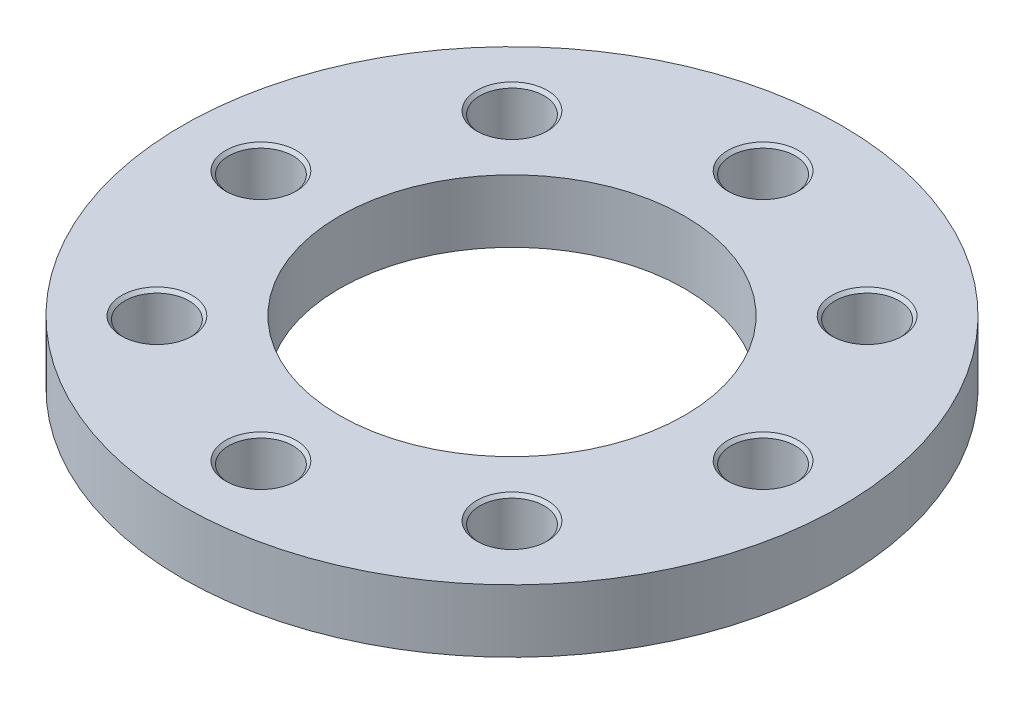
ISO-10303-21;
HEADER;
FILE_DESCRIPTION(('STEP AP214'),'2;1');
FILE_NAME('part.step','',(''),(''),'','','');
FILE_SCHEMA(('AUTOMOTIVE_DESIGN { 1 0 10303 214 1 1 1 1 }'));
ENDSEC;
DATA;
#1=APPLICATION_CONTEXT('core data for automotive mechanical design processes');
#2=APPLICATION_PROTOCOL_DEFINITION('international standard','automotive_design',2000,#1);
#3=PRODUCT_CONTEXT('',#1,'mechanical');
#4=PRODUCT('Part','Part','',(#3));
#5=PRODUCT_RELATED_PRODUCT_CATEGORY('part','',(#4));
#6=PRODUCT_DEFINITION_FORMATION('','',#4);
#7=PRODUCT_DEFINITION_CONTEXT('part definition',#1,'design');
#8=PRODUCT_DEFINITION('design','',#6,#7);
#9=PRODUCT_DEFINITION_SHAPE('','',#8);
#10=(LENGTH_UNIT() NAMED_UNIT(*) SI_UNIT(.MILLI.,.METRE.));
#11=(NAMED_UNIT(*) PLANE_ANGLE_UNIT() SI_UNIT($,.RADIAN.));
#12=(NAMED_UNIT(*) SI_UNIT($,.STERADIAN.) SOLID_ANGLE_UNIT());
#13=UNCERTAINTY_MEASURE_WITH_UNIT(LENGTH_MEASURE(1.E-05),#10,'distance_accuracy_value','');
#14=(GEOMETRIC_REPRESENTATION_CONTEXT(3) GLOBAL_UNCERTAINTY_ASSIGNED_CONTEXT((#13)) GLOBAL_UNIT_ASSIGNED_CONTEXT((#10,
#11,#12)) REPRESENTATION_CONTEXT('',''));
#15=CARTESIAN_POINT('',(0.,0.,0.));
#16=DIRECTION('',(0.,0.,1.));
#17=DIRECTION('',(1.,0.,0.));
#18=AXIS2_PLACEMENT_3D('',#15,#16,#17);
#19=CARTESIAN_POINT('',(0.,4.,0.));
#20=DIRECTION('',(0.,-1.,0.));
#21=DIRECTION('',(0.,0.,-1.));
#22=AXIS2_PLACEMENT_3D('',#19,#20,#21);
#23=CYLINDRICAL_SURFACE('',#22,11.);
#24=CARTESIAN_POINT('',(0.,4.,0.));
#25=DIRECTION('',(0.,1.,0.));
#26=DIRECTION('',(0.,0.,1.));
#27=AXIS2_PLACEMENT_3D('',#24,#25,#26);
#28=CIRCLE('',#27,11.);
#29=CARTESIAN_POINT('',(0.,4.,11.));
#30=VERTEX_POINT('',#29);
#31=EDGE_CURVE('E191',#30,#30,#28,.T.);
#32=ORIENTED_EDGE('',*,*,#31,.T.);
#33=EDGE_LOOP('',(#32));
#34=FACE_BOUND('',#33,.T.);
#35=CARTESIAN_POINT('',(0.,0.,0.));
#36=DIRECTION('',(0.,1.,0.));
#37=DIRECTION('',(0.,0.,1.));
#38=AXIS2_PLACEMENT_3D('',#35,#36,#37);
#39=CIRCLE('',#38,11.);
#40=CARTESIAN_POINT('',(0.,0.,11.));
#41=VERTEX_POINT('',#40);
#42=EDGE_CURVE('E192',#41,#41,#39,.T.);
#43=ORIENTED_EDGE('',*,*,#42,.F.);
#44=EDGE_LOOP('',(#43));
#45=FACE_BOUND('',#44,.T.);
#46=ADVANCED_FACE('F49',(#34,#45),#23,.F.);
#47=CARTESIAN_POINT('',(0.,4.,0.));
#48=DIRECTION('',(0.,-1.,0.));
#49=DIRECTION('',(0.,0.,-1.));
#50=AXIS2_PLACEMENT_3D('',#47,#48,#49);
#51=CYLINDRICAL_SURFACE('',#50,21.);
#52=CARTESIAN_POINT('',(0.,4.,0.));
#53=DIRECTION('',(0.,1.,0.));
#54=DIRECTION('',(0.,0.,1.));
#55=AXIS2_PLACEMENT_3D('',#52,#53,#54);
#56=CIRCLE('',#55,21.);
#57=CARTESIAN_POINT('',(0.,4.,21.));
#58=VERTEX_POINT('',#57);
#59=EDGE_CURVE('E186',#58,#58,#56,.T.);
#60=ORIENTED_EDGE('',*,*,#59,.F.);
#61=EDGE_LOOP('',(#60));
#62=FACE_BOUND('',#61,.T.);
#63=CARTESIAN_POINT('',(0.,0.,0.));
#64=DIRECTION('',(0.,1.,0.));
#65=DIRECTION('',(0.,0.,1.));
#66=AXIS2_PLACEMENT_3D('',#63,#64,#65);
#67=CIRCLE('',#66,21.);
#68=CARTESIAN_POINT('',(0.,0.,21.));
#69=VERTEX_POINT('',#68);
#70=EDGE_CURVE('E187',#69,#69,#67,.T.);
#71=ORIENTED_EDGE('',*,*,#70,.T.);
#72=EDGE_LOOP('',(#71));
#73=FACE_BOUND('',#72,.T.);
#74=ADVANCED_FACE('F209',(#62,#73),#51,.T.);
#75=CARTESIAN_POINT('',(0.,4.,0.));
#76=DIRECTION('',(0.,1.,0.));
#77=DIRECTION('',(0.,0.,1.));
#78=AXIS2_PLACEMENT_3D('',#75,#76,#77);
#79=PLANE('',#78);
#80=CARTESIAN_POINT('',(11.3137084989849,4.,11.3137084989846));
#81=DIRECTION('',(0.,1.,0.));
#82=DIRECTION('',(0.,0.,1.));
#83=AXIS2_PLACEMENT_3D('',#80,#81,#82);
#84=CIRCLE('',#83,2.24999999999998);
#85=CARTESIAN_POINT('',(11.3137084989849,4.,13.5637084989846));
#86=VERTEX_POINT('',#85);
#87=EDGE_CURVE('E58',#86,#86,#84,.F.);
#88=ORIENTED_EDGE('',*,*,#87,.T.);
#89=EDGE_LOOP('',(#88));
#90=FACE_BOUND('',#89,.T.);
#91=CARTESIAN_POINT('',(1.6759110426447E-13,4.,16.));
#92=DIRECTION('',(0.,1.,0.));
#93=DIRECTION('',(0.,0.,1.));
#94=AXIS2_PLACEMENT_3D('',#91,#92,#93);
#95=CIRCLE('',#94,2.25);
#96=CARTESIAN_POINT('',(1.6759110426447E-13,4.,18.25));
#97=VERTEX_POINT('',#96);
#98=EDGE_CURVE('E82',#97,#97,#95,.F.);
#99=ORIENTED_EDGE('',*,*,#98,.T.);
#100=EDGE_LOOP('',(#99));
#101=FACE_BOUND('',#100,.T.);
#102=CARTESIAN_POINT('',(-11.3137084989847,4.,11.3137084989849));
#103=DIRECTION('',(0.,1.,0.));
#104=DIRECTION('',(0.,0.,1.));
#105=AXIS2_PLACEMENT_3D('',#102,#103,#104);
#106=CIRCLE('',#105,2.25);
#107=CARTESIAN_POINT('',(-11.3137084989847,4.,13.5637084989849));
#108=VERTEX_POINT('',#107);
#109=EDGE_CURVE('E97',#108,#108,#106,.F.);
#110=ORIENTED_EDGE('',*,*,#109,.T.);
#111=EDGE_LOOP('',(#110));
#112=FACE_BOUND('',#111,.T.);
#113=CARTESIAN_POINT('',(-16.,4.,0.));
#114=DIRECTION('',(0.,1.,0.));
#115=DIRECTION('',(0.,0.,1.));
#116=AXIS2_PLACEMENT_3D('',#113,#114,#115);
#117=CIRCLE('',#116,2.25);
#118=CARTESIAN_POINT('',(-16.,4.,2.25));
#119=VERTEX_POINT('',#118);
#120=EDGE_CURVE('E113',#119,#119,#117,.F.);
#121=ORIENTED_EDGE('',*,*,#120,.T.);
#122=EDGE_LOOP('',(#121));
#123=FACE_BOUND('',#122,.T.);
#124=CARTESIAN_POINT('',(-11.3137084989848,4.,-11.3137084989847));
#125=DIRECTION('',(0.,1.,0.));
#126=DIRECTION('',(0.,0.,1.));
#127=AXIS2_PLACEMENT_3D('',#124,#125,#126);
#128=CIRCLE('',#127,2.25000000000001);
#129=CARTESIAN_POINT('',(-11.3137084989848,4.,-9.06370849898469));
#130=VERTEX_POINT('',#129);
#131=EDGE_CURVE('E128',#130,#130,#128,.F.);
#132=ORIENTED_EDGE('',*,*,#131,.T.);
#133=EDGE_LOOP('',(#132));
#134=FACE_BOUND('',#133,.T.);
#135=CARTESIAN_POINT('',(0.,4.,-16.));
#136=DIRECTION('',(0.,1.,0.));
#137=DIRECTION('',(0.,0.,1.));
#138=AXIS2_PLACEMENT_3D('',#135,#136,#137);
#139=CIRCLE('',#138,2.25);
#140=CARTESIAN_POINT('',(0.,4.,-13.75));
#141=VERTEX_POINT('',#140);
#142=EDGE_CURVE('E143',#141,#141,#139,.F.);
#143=ORIENTED_EDGE('',*,*,#142,.T.);
#144=EDGE_LOOP('',(#143));
#145=FACE_BOUND('',#144,.T.);
#146=CARTESIAN_POINT('',(11.3137084989847,4.,-11.3137084989848));
#147=DIRECTION('',(0.,1.,0.));
#148=DIRECTION('',(0.,0.,1.));
#149=AXIS2_PLACEMENT_3D('',#146,#147,#148);
#150=CIRCLE('',#149,2.25);
#151=CARTESIAN_POINT('',(11.3137084989847,4.,-9.06370849898478));
#152=VERTEX_POINT('',#151);
#153=EDGE_CURVE('E158',#152,#152,#150,.F.);
#154=ORIENTED_EDGE('',*,*,#153,.T.);
#155=EDGE_LOOP('',(#154));
#156=FACE_BOUND('',#155,.T.);
#157=CARTESIAN_POINT('',(16.,4.,0.));
#158=DIRECTION('',(0.,1.,0.));
#159=DIRECTION('',(0.,0.,1.));
#160=AXIS2_PLACEMENT_3D('',#157,#158,#159);
#161=CIRCLE('',#160,2.25);
#162=CARTESIAN_POINT('',(16.,4.,2.25));
#163=VERTEX_POINT('',#162);
#164=EDGE_CURVE('E174',#163,#163,#161,.F.);
#165=ORIENTED_EDGE('',*,*,#164,.T.);
#166=EDGE_LOOP('',(#165));
#167=FACE_BOUND('',#166,.T.);
#168=ORIENTED_EDGE('',*,*,#31,.F.);
#169=EDGE_LOOP('',(#168));
#170=FACE_BOUND('',#169,.T.);
#171=ORIENTED_EDGE('',*,*,#59,.T.);
#172=EDGE_LOOP('',(#171));
#173=FACE_BOUND('',#172,.T.);
#174=ADVANCED_FACE('F205',(#90,#101,#112,#123,#134,#145,#156,#167,#170,#173),#79,.T.);
#175=CARTESIAN_POINT('',(0.,0.,0.));
#176=DIRECTION('',(0.,1.,0.));
#177=DIRECTION('',(0.,0.,1.));
#178=AXIS2_PLACEMENT_3D('',#175,#176,#177);
#179=PLANE('',#178);
#180=CARTESIAN_POINT('',(11.3137084989849,0.,11.3137084989846));
#181=DIRECTION('',(0.,1.,0.));
#182=DIRECTION('',(0.,0.,1.));
#183=AXIS2_PLACEMENT_3D('',#180,#181,#182);
#184=CIRCLE('',#183,2.25);
#185=CARTESIAN_POINT('',(11.3137084989849,0.,13.5637084989846));
#186=VERTEX_POINT('',#185);
#187=EDGE_CURVE('E10',#186,#186,#184,.T.);
#188=ORIENTED_EDGE('',*,*,#187,.T.);
#189=EDGE_LOOP('',(#188));
#190=FACE_BOUND('',#189,.T.);
#191=CARTESIAN_POINT('',(1.6759110426447E-13,0.,16.));
#192=DIRECTION('',(0.,1.,0.));
#193=DIRECTION('',(0.,0.,1.));
#194=AXIS2_PLACEMENT_3D('',#191,#192,#193);
#195=CIRCLE('',#194,2.25);
#196=CARTESIAN_POINT('',(1.6759110426447E-13,0.,13.75));
#197=VERTEX_POINT('',#196);
#198=EDGE_CURVE('E78',#197,#197,#195,.T.);
#199=ORIENTED_EDGE('',*,*,#198,.T.);
#200=EDGE_LOOP('',(#199));
#201=FACE_BOUND('',#200,.T.);
#202=CARTESIAN_POINT('',(-11.3137084989847,0.,11.3137084989849));
#203=DIRECTION('',(0.,1.,0.));
#204=DIRECTION('',(0.,0.,1.));
#205=AXIS2_PLACEMENT_3D('',#202,#203,#204);
#206=CIRCLE('',#205,2.25);
#207=CARTESIAN_POINT('',(-11.3137084989847,0.,13.5637084989849));
#208=VERTEX_POINT('',#207);
#209=EDGE_CURVE('E93',#208,#208,#206,.T.);
#210=ORIENTED_EDGE('',*,*,#209,.T.);
#211=EDGE_LOOP('',(#210));
#212=FACE_BOUND('',#211,.T.);
#213=CARTESIAN_POINT('',(-16.,0.,0.));
#214=DIRECTION('',(0.,1.,0.));
#215=DIRECTION('',(0.,0.,1.));
#216=AXIS2_PLACEMENT_3D('',#213,#214,#215);
#217=CIRCLE('',#216,2.25);
#218=CARTESIAN_POINT('',(-16.,0.,-2.25));
#219=VERTEX_POINT('',#218);
#220=EDGE_CURVE('E109',#219,#219,#217,.T.);
#221=ORIENTED_EDGE('',*,*,#220,.T.);
#222=EDGE_LOOP('',(#221));
#223=FACE_BOUND('',#222,.T.);
#224=CARTESIAN_POINT('',(-11.3137084989848,0.,-11.3137084989847));
#225=DIRECTION('',(0.,1.,0.));
#226=DIRECTION('',(0.,0.,1.));
#227=AXIS2_PLACEMENT_3D('',#224,#225,#226);
#228=CIRCLE('',#227,2.24999999999999);
#229=CARTESIAN_POINT('',(-11.3137084989848,0.,-9.06370849898471));
#230=VERTEX_POINT('',#229);
#231=EDGE_CURVE('E124',#230,#230,#228,.T.);
#232=ORIENTED_EDGE('',*,*,#231,.T.);
#233=EDGE_LOOP('',(#232));
#234=FACE_BOUND('',#233,.T.);
#235=CARTESIAN_POINT('',(0.,0.,-16.));
#236=DIRECTION('',(0.,1.,0.));
#237=DIRECTION('',(0.,0.,1.));
#238=AXIS2_PLACEMENT_3D('',#235,#236,#237);
#239=CIRCLE('',#238,2.25);
#240=CARTESIAN_POINT('',(0.,0.,-18.25));
#241=VERTEX_POINT('',#240);
#242=EDGE_CURVE('E139',#241,#241,#239,.T.);
#243=ORIENTED_EDGE('',*,*,#242,.T.);
#244=EDGE_LOOP('',(#243));
#245=FACE_BOUND('',#244,.T.);
#246=CARTESIAN_POINT('',(11.3137084989847,0.,-11.3137084989848));
#247=DIRECTION('',(0.,1.,0.));
#248=DIRECTION('',(0.,0.,1.));
#249=AXIS2_PLACEMENT_3D('',#246,#247,#248);
#250=CIRCLE('',#249,2.25);
#251=CARTESIAN_POINT('',(11.3137084989847,0.,-9.06370849898478));
#252=VERTEX_POINT('',#251);
#253=EDGE_CURVE('E154',#252,#252,#250,.T.);
#254=ORIENTED_EDGE('',*,*,#253,.T.);
#255=EDGE_LOOP('',(#254));
#256=FACE_BOUND('',#255,.T.);
#257=CARTESIAN_POINT('',(16.,0.,0.));
#258=DIRECTION('',(0.,1.,0.));
#259=DIRECTION('',(0.,0.,1.));
#260=AXIS2_PLACEMENT_3D('',#257,#258,#259);
#261=CIRCLE('',#260,2.25);
#262=CARTESIAN_POINT('',(16.,0.,-2.25));
#263=VERTEX_POINT('',#262);
#264=EDGE_CURVE('E170',#263,#263,#261,.T.);
#265=ORIENTED_EDGE('',*,*,#264,.T.);
#266=EDGE_LOOP('',(#265));
#267=FACE_BOUND('',#266,.T.);
#268=ORIENTED_EDGE('',*,*,#42,.T.);
#269=EDGE_LOOP('',(#268));
#270=FACE_BOUND('',#269,.T.);
#271=ORIENTED_EDGE('',*,*,#70,.F.);
#272=EDGE_LOOP('',(#271));
#273=FACE_BOUND('',#272,.T.);
#274=ADVANCED_FACE('F208',(#190,#201,#212,#223,#234,#245,#256,#267,#270,#273),#179,.F.);
#275=CARTESIAN_POINT('',(16.,0.,0.));
#276=DIRECTION('',(0.,1.,0.));
#277=DIRECTION('',(0.,0.,1.));
#278=AXIS2_PLACEMENT_3D('',#275,#276,#277);
#279=CYLINDRICAL_SURFACE('',#278,2.05);
#280=CARTESIAN_POINT('',(16.,3.8,0.));
#281=DIRECTION('',(0.,1.,0.));
#282=DIRECTION('',(0.,0.,1.));
#283=AXIS2_PLACEMENT_3D('',#280,#281,#282);
#284=CIRCLE('',#283,2.05);
#285=CARTESIAN_POINT('',(16.,3.8,2.05));
#286=VERTEX_POINT('',#285);
#287=EDGE_CURVE('E178',#286,#286,#284,.T.);
#288=ORIENTED_EDGE('',*,*,#287,.T.);
#289=EDGE_LOOP('',(#288));
#290=FACE_BOUND('',#289,.T.);
#291=CARTESIAN_POINT('',(16.,0.200000000000005,0.));
#292=DIRECTION('',(0.,1.,0.));
#293=DIRECTION('',(0.,0.,1.));
#294=AXIS2_PLACEMENT_3D('',#291,#292,#293);
#295=CIRCLE('',#294,2.05);
#296=CARTESIAN_POINT('',(16.,0.200000000000005,-2.05));
#297=VERTEX_POINT('',#296);
#298=EDGE_CURVE('E182',#297,#297,#295,.F.);
#299=ORIENTED_EDGE('',*,*,#298,.T.);
#300=EDGE_LOOP('',(#299));
#301=FACE_BOUND('',#300,.T.);
#302=ADVANCED_FACE('F219',(#290,#301),#279,.F.);
#303=CARTESIAN_POINT('',(16.,3.8,0.));
#304=DIRECTION('',(0.,1.,0.));
#305=DIRECTION('',(0.,0.,1.));
#306=AXIS2_PLACEMENT_3D('',#303,#304,#305);
#307=CONICAL_SURFACE('',#306,2.05,0.785398163397439);
#308=ORIENTED_EDGE('',*,*,#164,.F.);
#309=EDGE_LOOP('',(#308));
#310=FACE_BOUND('',#309,.T.);
#311=ORIENTED_EDGE('',*,*,#287,.F.);
#312=EDGE_LOOP('',(#311));
#313=FACE_BOUND('',#312,.T.);
#314=ADVANCED_FACE('F223',(#310,#313),#307,.F.);
#315=CARTESIAN_POINT('',(16.,0.,0.));
#316=DIRECTION('',(0.,-1.,0.));
#317=DIRECTION('',(0.,0.,-1.));
#318=AXIS2_PLACEMENT_3D('',#315,#316,#317);
#319=CONICAL_SURFACE('',#318,2.25,0.785398163397441);
#320=CARTESIAN_POINT('',(16.,0.200000000000005,-2.05));
#321=CARTESIAN_POINT('',(16.,0.197916666666672,-2.05208333333333));
#322=CARTESIAN_POINT('',(16.,0.195833333333338,-2.05416666666667));
#323=CARTESIAN_POINT('',(16.,0.191666666666671,-2.05833333333333));
#324=CARTESIAN_POINT('',(16.,0.189583333333338,-2.06041666666667));
#325=CARTESIAN_POINT('',(16.,0.185416666666671,-2.06458333333333));
#326=CARTESIAN_POINT('',(16.,0.183333333333338,-2.06666666666667));
#327=CARTESIAN_POINT('',(16.,0.179166666666671,-2.07083333333333));
#328=CARTESIAN_POINT('',(16.,0.177083333333338,-2.07291666666667));
#329=CARTESIAN_POINT('',(16.,0.172916666666671,-2.07708333333333));
#330=CARTESIAN_POINT('',(16.,0.170833333333338,-2.07916666666667));
#331=CARTESIAN_POINT('',(16.,0.166666666666671,-2.08333333333333));
#332=CARTESIAN_POINT('',(16.,0.164583333333337,-2.08541666666667));
#333=CARTESIAN_POINT('',(16.,0.160416666666671,-2.08958333333333));
#334=CARTESIAN_POINT('',(16.,0.158333333333337,-2.09166666666667));
#335=CARTESIAN_POINT('',(16.,0.15416666666667,-2.09583333333333));
#336=CARTESIAN_POINT('',(16.,0.152083333333337,-2.09791666666667));
#337=CARTESIAN_POINT('',(16.,0.14791666666667,-2.10208333333333));
#338=CARTESIAN_POINT('',(16.,0.145833333333337,-2.10416666666667));
#339=CARTESIAN_POINT('',(16.,0.14166666666667,-2.10833333333333));
#340=CARTESIAN_POINT('',(16.,0.139583333333337,-2.11041666666667));
#341=CARTESIAN_POINT('',(16.,0.13541666666667,-2.11458333333333));
#342=CARTESIAN_POINT('',(16.,0.133333333333337,-2.11666666666667));
#343=CARTESIAN_POINT('',(16.,0.12916666666667,-2.12083333333333));
#344=CARTESIAN_POINT('',(16.,0.127083333333336,-2.12291666666667));
#345=CARTESIAN_POINT('',(16.,0.12291666666667,-2.12708333333333));
#346=CARTESIAN_POINT('',(16.,0.120833333333336,-2.12916666666667));
#347=CARTESIAN_POINT('',(16.,0.116666666666669,-2.13333333333333));
#348=CARTESIAN_POINT('',(16.,0.114583333333336,-2.13541666666667));
#349=CARTESIAN_POINT('',(16.,0.110416666666669,-2.13958333333333));
#350=CARTESIAN_POINT('',(16.,0.108333333333336,-2.14166666666667));
#351=CARTESIAN_POINT('',(16.,0.104166666666669,-2.14583333333333));
#352=CARTESIAN_POINT('',(16.,0.102083333333336,-2.14791666666667));
#353=CARTESIAN_POINT('',(16.,0.097916666666669,-2.15208333333333));
#354=CARTESIAN_POINT('',(16.,0.0958333333333357,-2.15416666666667));
#355=CARTESIAN_POINT('',(16.,0.0916666666666689,-2.15833333333333));
#356=CARTESIAN_POINT('',(16.,0.0895833333333355,-2.16041666666667));
#357=CARTESIAN_POINT('',(16.,0.0854166666666688,-2.16458333333333));
#358=CARTESIAN_POINT('',(16.,0.0833333333333354,-2.16666666666667));
#359=CARTESIAN_POINT('',(16.,0.0791666666666686,-2.17083333333333));
#360=CARTESIAN_POINT('',(16.,0.0770833333333352,-2.17291666666667));
#361=CARTESIAN_POINT('',(16.,0.0729166666666684,-2.17708333333333));
#362=CARTESIAN_POINT('',(16.,0.0708333333333351,-2.17916666666667));
#363=CARTESIAN_POINT('',(16.,0.0666666666666683,-2.18333333333333));
#364=CARTESIAN_POINT('',(16.,0.064583333333335,-2.18541666666667));
#365=CARTESIAN_POINT('',(16.,0.0604166666666682,-2.18958333333333));
#366=CARTESIAN_POINT('',(16.,0.0583333333333347,-2.19166666666667));
#367=CARTESIAN_POINT('',(16.,0.054166666666668,-2.19583333333333));
#368=CARTESIAN_POINT('',(16.,0.0520833333333346,-2.19791666666667));
#369=CARTESIAN_POINT('',(16.,0.0479166666666678,-2.20208333333334));
#370=CARTESIAN_POINT('',(16.,0.0458333333333344,-2.20416666666667));
#371=CARTESIAN_POINT('',(16.,0.0416666666666677,-2.20833333333334));
#372=CARTESIAN_POINT('',(16.,0.0395833333333343,-2.21041666666667));
#373=CARTESIAN_POINT('',(16.,0.0354166666666675,-2.21458333333333));
#374=CARTESIAN_POINT('',(16.,0.0333333333333341,-2.21666666666667));
#375=CARTESIAN_POINT('',(16.,0.0291666666666673,-2.22083333333333));
#376=CARTESIAN_POINT('',(16.,0.027083333333334,-2.22291666666667));
#377=CARTESIAN_POINT('',(16.,0.0229166666666672,-2.22708333333334));
#378=CARTESIAN_POINT('',(16.,0.0208333333333338,-2.22916666666667));
#379=CARTESIAN_POINT('',(16.,0.0166666666666671,-2.23333333333334));
#380=CARTESIAN_POINT('',(16.,0.0145833333333337,-2.23541666666667));
#381=CARTESIAN_POINT('',(16.,0.010416666666667,-2.23958333333334));
#382=CARTESIAN_POINT('',(16.,0.00833333333333353,-2.24166666666667));
#383=CARTESIAN_POINT('',(16.,0.0041666666666667,-2.24583333333334));
#384=CARTESIAN_POINT('',(16.,0.00208333333333328,-2.24791666666667));
#385=CARTESIAN_POINT('',(16.,0.,-2.25));
#386=B_SPLINE_CURVE_WITH_KNOTS('',3,(#320,#321,#322,#323,#324,#325,#326,#327,#328,#329,#330,
#331,#332,#333,#334,#335,#336,#337,#338,#339,#340,#341,#342,#343,#344,#345,#346,#347,#348,#349,
#350,#351,#352,#353,#354,#355,#356,#357,#358,#359,#360,#361,#362,#363,#364,#365,#366,#367,#368,
#369,#370,#371,#372,#373,#374,#375,#376,#377,#378,#379,#380,#381,#382,#383,#384,#385),
.UNSPECIFIED.,.F.,.F.,(4,2,2,2,2,2,2,2,2,2,2,2,2,2,2,2,2,2,2,2,2,2,2,2,2,2,2,2,2,2,2,2,4),(0.,
0.00883883476483208,0.0176776695296638,0.0265165042944959,0.035355339059328,0.0441941738241601,
0.0530330085889919,0.061871843353824,0.070710678118656,0.0795495128834878,0.0883883476483199,
0.097227182413152,0.106066017177984,0.114904851942816,0.123743686707648,0.13258252147248,
0.141421356237312,0.150260191002144,0.159099025766976,0.167937860531808,0.17677669529664,
0.185615530061472,0.194454364826304,0.203293199591136,0.212132034355968,0.2209708691208,
0.229809703885632,0.238648538650464,0.247487373415296,0.256326208180128,0.26516504294496,
0.274003877709792,0.282842712474624),.UNSPECIFIED.);
#387=EDGE_CURVE('BSEAM237',#297,#263,#386,.T.);
#388=ORIENTED_EDGE('',*,*,#298,.F.);
#389=ORIENTED_EDGE('',*,*,#264,.F.);
#390=ORIENTED_EDGE('',*,*,#387,.T.);
#391=ORIENTED_EDGE('',*,*,#387,.F.);
#392=EDGE_LOOP('',(#388,#390,#389,#391));
#393=FACE_BOUND('',#392,.T.);
#394=ADVANCED_FACE('F237',(#393),#319,.F.);
#395=CARTESIAN_POINT('',(11.3137084989847,0.,-11.3137084989848));
#396=DIRECTION('',(0.,1.,0.));
#397=DIRECTION('',(0.,0.,1.));
#398=AXIS2_PLACEMENT_3D('',#395,#396,#397);
#399=CYLINDRICAL_SURFACE('',#398,2.05);
#400=CARTESIAN_POINT('',(11.3137084989847,3.8,-11.3137084989848));
#401=DIRECTION('',(0.,1.,0.));
#402=DIRECTION('',(0.,0.,1.));
#403=AXIS2_PLACEMENT_3D('',#400,#401,#402);
#404=CIRCLE('',#403,2.05);
#405=CARTESIAN_POINT('',(11.3137084989847,3.8,-9.26370849898478));
#406=VERTEX_POINT('',#405);
#407=EDGE_CURVE('E162',#406,#406,#404,.T.);
#408=ORIENTED_EDGE('',*,*,#407,.T.);
#409=EDGE_LOOP('',(#408));
#410=FACE_BOUND('',#409,.T.);
#411=CARTESIAN_POINT('',(11.3137084989847,0.199999999999995,-11.3137084989848));
#412=DIRECTION('',(0.,1.,0.));
#413=DIRECTION('',(0.,0.,1.));
#414=AXIS2_PLACEMENT_3D('',#411,#412,#413);
#415=CIRCLE('',#414,2.05);
#416=CARTESIAN_POINT('',(11.3137084989847,0.199999999999995,-9.26370849898478));
#417=VERTEX_POINT('',#416);
#418=EDGE_CURVE('E166',#417,#417,#415,.F.);
#419=ORIENTED_EDGE('',*,*,#418,.T.);
#420=EDGE_LOOP('',(#419));
#421=FACE_BOUND('',#420,.T.);
#422=ADVANCED_FACE('F244',(#410,#421),#399,.F.);
#423=CARTESIAN_POINT('',(11.3137084989849,0.,11.3137084989846));
#424=DIRECTION('',(0.,1.,0.));
#425=DIRECTION('',(0.,0.,1.));
#426=AXIS2_PLACEMENT_3D('',#423,#424,#425);
#427=CYLINDRICAL_SURFACE('',#426,2.05);
#428=CARTESIAN_POINT('',(11.3137084989849,3.80000000000001,11.3137084989846));
#429=DIRECTION('',(0.,1.,0.));
#430=DIRECTION('',(0.,0.,1.));
#431=AXIS2_PLACEMENT_3D('',#428,#429,#430);
#432=CIRCLE('',#431,2.05);
#433=CARTESIAN_POINT('',(11.3137084989849,3.80000000000001,13.3637084989846));
#434=VERTEX_POINT('',#433);
#435=EDGE_CURVE('E65',#434,#434,#432,.T.);
#436=ORIENTED_EDGE('',*,*,#435,.T.);
#437=EDGE_LOOP('',(#436));
#438=FACE_BOUND('',#437,.T.);
#439=CARTESIAN_POINT('',(11.3137084989849,0.199999999999995,11.3137084989846));
#440=DIRECTION('',(0.,1.,0.));
#441=DIRECTION('',(0.,0.,1.));
#442=AXIS2_PLACEMENT_3D('',#439,#440,#441);
#443=CIRCLE('',#442,2.05);
#444=CARTESIAN_POINT('',(11.3137084989849,0.199999999999995,13.3637084989846));
#445=VERTEX_POINT('',#444);
#446=EDGE_CURVE('E72',#445,#445,#443,.F.);
#447=ORIENTED_EDGE('',*,*,#446,.T.);
#448=EDGE_LOOP('',(#447));
#449=FACE_BOUND('',#448,.T.);
#450=ADVANCED_FACE('F341',(#438,#449),#427,.F.);
#451=CARTESIAN_POINT('',(1.6759110426447E-13,0.,16.));
#452=DIRECTION('',(0.,1.,0.));
#453=DIRECTION('',(0.,0.,1.));
#454=AXIS2_PLACEMENT_3D('',#451,#452,#453);
#455=CYLINDRICAL_SURFACE('',#454,2.05);
#456=CARTESIAN_POINT('',(1.6759110426447E-13,3.8,16.));
#457=DIRECTION('',(0.,1.,0.));
#458=DIRECTION('',(0.,0.,1.));
#459=AXIS2_PLACEMENT_3D('',#456,#457,#458);
#460=CIRCLE('',#459,2.05);
#461=CARTESIAN_POINT('',(1.6759110426447E-13,3.8,18.05));
#462=VERTEX_POINT('',#461);
#463=EDGE_CURVE('E85',#462,#462,#460,.T.);
#464=ORIENTED_EDGE('',*,*,#463,.T.);
#465=EDGE_LOOP('',(#464));
#466=FACE_BOUND('',#465,.T.);
#467=CARTESIAN_POINT('',(1.6759110426447E-13,0.200000000000005,16.));
#468=DIRECTION('',(0.,1.,0.));
#469=DIRECTION('',(0.,0.,1.));
#470=AXIS2_PLACEMENT_3D('',#467,#468,#469);
#471=CIRCLE('',#470,2.05);
#472=CARTESIAN_POINT('',(1.6759110426447E-13,0.200000000000005,13.95));
#473=VERTEX_POINT('',#472);
#474=EDGE_CURVE('E89',#473,#473,#471,.F.);
#475=ORIENTED_EDGE('',*,*,#474,.T.);
#476=EDGE_LOOP('',(#475));
#477=FACE_BOUND('',#476,.T.);
#478=ADVANCED_FACE('F344',(#466,#477),#455,.F.);
#479=CARTESIAN_POINT('',(-11.3137084989847,0.,11.3137084989849));
#480=DIRECTION('',(0.,1.,0.));
#481=DIRECTION('',(0.,0.,1.));
#482=AXIS2_PLACEMENT_3D('',#479,#480,#481);
#483=CYLINDRICAL_SURFACE('',#482,2.05);
#484=CARTESIAN_POINT('',(-11.3137084989847,3.8,11.3137084989849));
#485=DIRECTION('',(0.,1.,0.));
#486=DIRECTION('',(0.,0.,1.));
#487=AXIS2_PLACEMENT_3D('',#484,#485,#486);
#488=CIRCLE('',#487,2.05);
#489=CARTESIAN_POINT('',(-11.3137084989847,3.8,13.3637084989849));
#490=VERTEX_POINT('',#489);
#491=EDGE_CURVE('E101',#490,#490,#488,.T.);
#492=ORIENTED_EDGE('',*,*,#491,.T.);
#493=EDGE_LOOP('',(#492));
#494=FACE_BOUND('',#493,.T.);
#495=CARTESIAN_POINT('',(-11.3137084989847,0.199999999999995,11.3137084989849));
#496=DIRECTION('',(0.,1.,0.));
#497=DIRECTION('',(0.,0.,1.));
#498=AXIS2_PLACEMENT_3D('',#495,#496,#497);
#499=CIRCLE('',#498,2.05);
#500=CARTESIAN_POINT('',(-11.3137084989847,0.199999999999995,13.3637084989849));
#501=VERTEX_POINT('',#500);
#502=EDGE_CURVE('E105',#501,#501,#499,.F.);
#503=ORIENTED_EDGE('',*,*,#502,.T.);
#504=EDGE_LOOP('',(#503));
#505=FACE_BOUND('',#504,.T.);
#506=ADVANCED_FACE('F351',(#494,#505),#483,.F.);
#507=CARTESIAN_POINT('',(-16.,0.,0.));
#508=DIRECTION('',(0.,1.,0.));
#509=DIRECTION('',(0.,0.,1.));
#510=AXIS2_PLACEMENT_3D('',#507,#508,#509);
#511=CYLINDRICAL_SURFACE('',#510,2.05);
#512=CARTESIAN_POINT('',(-16.,3.8,0.));
#513=DIRECTION('',(0.,1.,0.));
#514=DIRECTION('',(0.,0.,1.));
#515=AXIS2_PLACEMENT_3D('',#512,#513,#514);
#516=CIRCLE('',#515,2.05);
#517=CARTESIAN_POINT('',(-16.,3.8,2.05));
#518=VERTEX_POINT('',#517);
#519=EDGE_CURVE('E116',#518,#518,#516,.T.);
#520=ORIENTED_EDGE('',*,*,#519,.T.);
#521=EDGE_LOOP('',(#520));
#522=FACE_BOUND('',#521,.T.);
#523=CARTESIAN_POINT('',(-16.,0.200000000000005,0.));
#524=DIRECTION('',(0.,1.,0.));
#525=DIRECTION('',(0.,0.,1.));
#526=AXIS2_PLACEMENT_3D('',#523,#524,#525);
#527=CIRCLE('',#526,2.05);
#528=CARTESIAN_POINT('',(-16.,0.200000000000005,-2.05));
#529=VERTEX_POINT('',#528);
#530=EDGE_CURVE('E120',#529,#529,#527,.F.);
#531=ORIENTED_EDGE('',*,*,#530,.T.);
#532=EDGE_LOOP('',(#531));
#533=FACE_BOUND('',#532,.T.);
#534=ADVANCED_FACE('F363',(#522,#533),#511,.F.);
#535=CARTESIAN_POINT('',(-11.3137084989848,0.,-11.3137084989847));
#536=DIRECTION('',(0.,1.,0.));
#537=DIRECTION('',(0.,0.,1.));
#538=AXIS2_PLACEMENT_3D('',#535,#536,#537);
#539=CYLINDRICAL_SURFACE('',#538,2.05);
#540=CARTESIAN_POINT('',(-11.3137084989848,3.79999999999999,-11.3137084989847));
#541=DIRECTION('',(0.,1.,0.));
#542=DIRECTION('',(0.,0.,1.));
#543=AXIS2_PLACEMENT_3D('',#540,#541,#542);
#544=CIRCLE('',#543,2.05);
#545=CARTESIAN_POINT('',(-11.3137084989848,3.79999999999999,-9.2637084989847));
#546=VERTEX_POINT('',#545);
#547=EDGE_CURVE('E132',#546,#546,#544,.T.);
#548=ORIENTED_EDGE('',*,*,#547,.T.);
#549=EDGE_LOOP('',(#548));
#550=FACE_BOUND('',#549,.T.);
#551=CARTESIAN_POINT('',(-11.3137084989848,0.199999999999995,-11.3137084989847));
#552=DIRECTION('',(0.,1.,0.));
#553=DIRECTION('',(0.,0.,1.));
#554=AXIS2_PLACEMENT_3D('',#551,#552,#553);
#555=CIRCLE('',#554,2.05);
#556=CARTESIAN_POINT('',(-11.3137084989848,0.199999999999995,-9.2637084989847));
#557=VERTEX_POINT('',#556);
#558=EDGE_CURVE('E136',#557,#557,#555,.F.);
#559=ORIENTED_EDGE('',*,*,#558,.T.);
#560=EDGE_LOOP('',(#559));
#561=FACE_BOUND('',#560,.T.);
#562=ADVANCED_FACE('F359',(#550,#561),#539,.F.);
#563=CARTESIAN_POINT('',(0.,0.,-16.));
#564=DIRECTION('',(0.,1.,0.));
#565=DIRECTION('',(0.,0.,1.));
#566=AXIS2_PLACEMENT_3D('',#563,#564,#565);
#567=CYLINDRICAL_SURFACE('',#566,2.05);
#568=CARTESIAN_POINT('',(0.,3.8,-16.));
#569=DIRECTION('',(0.,1.,0.));
#570=DIRECTION('',(0.,0.,1.));
#571=AXIS2_PLACEMENT_3D('',#568,#569,#570);
#572=CIRCLE('',#571,2.05);
#573=CARTESIAN_POINT('',(0.,3.8,-13.95));
#574=VERTEX_POINT('',#573);
#575=EDGE_CURVE('E147',#574,#574,#572,.T.);
#576=ORIENTED_EDGE('',*,*,#575,.T.);
#577=EDGE_LOOP('',(#576));
#578=FACE_BOUND('',#577,.T.);
#579=CARTESIAN_POINT('',(0.,0.200000000000005,-16.));
#580=DIRECTION('',(0.,1.,0.));
#581=DIRECTION('',(0.,0.,1.));
#582=AXIS2_PLACEMENT_3D('',#579,#580,#581);
#583=CIRCLE('',#582,2.05);
#584=CARTESIAN_POINT('',(0.,0.200000000000005,-18.05));
#585=VERTEX_POINT('',#584);
#586=EDGE_CURVE('E150',#585,#585,#583,.F.);
#587=ORIENTED_EDGE('',*,*,#586,.T.);
#588=EDGE_LOOP('',(#587));
#589=FACE_BOUND('',#588,.T.);
#590=ADVANCED_FACE('F253',(#578,#589),#567,.F.);
#591=CARTESIAN_POINT('',(11.3137084989847,3.8,-11.3137084989848));
#592=DIRECTION('',(0.,1.,0.));
#593=DIRECTION('',(0.,0.,1.));
#594=AXIS2_PLACEMENT_3D('',#591,#592,#593);
#595=CONICAL_SURFACE('',#594,2.05,0.785398163397441);
#596=ORIENTED_EDGE('',*,*,#153,.F.);
#597=EDGE_LOOP('',(#596));
#598=FACE_BOUND('',#597,.T.);
#599=ORIENTED_EDGE('',*,*,#407,.F.);
#600=EDGE_LOOP('',(#599));
#601=FACE_BOUND('',#600,.T.);
#602=ADVANCED_FACE('F246',(#598,#601),#595,.F.);
#603=CARTESIAN_POINT('',(11.3137084989847,0.,-11.3137084989848));
#604=DIRECTION('',(0.,-1.,0.));
#605=DIRECTION('',(0.,0.,-1.));
#606=AXIS2_PLACEMENT_3D('',#603,#604,#605);
#607=CONICAL_SURFACE('',#606,2.25,0.785398163397449);
#608=ORIENTED_EDGE('',*,*,#418,.F.);
#609=EDGE_LOOP('',(#608));
#610=FACE_BOUND('',#609,.T.);
#611=ORIENTED_EDGE('',*,*,#253,.F.);
#612=EDGE_LOOP('',(#611));
#613=FACE_BOUND('',#612,.T.);
#614=ADVANCED_FACE('F252',(#610,#613),#607,.F.);
#615=CARTESIAN_POINT('',(0.,3.8,-16.));
#616=DIRECTION('',(0.,1.,0.));
#617=DIRECTION('',(0.,0.,1.));
#618=AXIS2_PLACEMENT_3D('',#615,#616,#617);
#619=CONICAL_SURFACE('',#618,2.05,0.785398163397439);
#620=ORIENTED_EDGE('',*,*,#142,.F.);
#621=EDGE_LOOP('',(#620));
#622=FACE_BOUND('',#621,.T.);
#623=ORIENTED_EDGE('',*,*,#575,.F.);
#624=EDGE_LOOP('',(#623));
#625=FACE_BOUND('',#624,.T.);
#626=ADVANCED_FACE('F260',(#622,#625),#619,.F.);
#627=CARTESIAN_POINT('',(0.,0.,-16.));
#628=DIRECTION('',(0.,-1.,0.));
#629=DIRECTION('',(0.,0.,-1.));
#630=AXIS2_PLACEMENT_3D('',#627,#628,#629);
#631=CONICAL_SURFACE('',#630,2.25,0.785398163397441);
#632=CARTESIAN_POINT('',(0.,0.200000000000005,-18.05));
#633=CARTESIAN_POINT('',(0.,0.197916666666671,-18.0520833333333));
#634=CARTESIAN_POINT('',(0.,0.195833333333338,-18.0541666666667));
#635=CARTESIAN_POINT('',(0.,0.191666666666671,-18.0583333333333));
#636=CARTESIAN_POINT('',(0.,0.189583333333338,-18.0604166666667));
#637=CARTESIAN_POINT('',(0.,0.185416666666672,-18.0645833333333));
#638=CARTESIAN_POINT('',(0.,0.183333333333338,-18.0666666666667));
#639=CARTESIAN_POINT('',(0.,0.179166666666671,-18.0708333333333));
#640=CARTESIAN_POINT('',(0.,0.177083333333338,-18.0729166666667));
#641=CARTESIAN_POINT('',(0.,0.172916666666671,-18.0770833333333));
#642=CARTESIAN_POINT('',(0.,0.170833333333338,-18.0791666666667));
#643=CARTESIAN_POINT('',(0.,0.166666666666671,-18.0833333333333));
#644=CARTESIAN_POINT('',(0.,0.164583333333337,-18.0854166666667));
#645=CARTESIAN_POINT('',(0.,0.16041666666667,-18.0895833333333));
#646=CARTESIAN_POINT('',(0.,0.158333333333337,-18.0916666666667));
#647=CARTESIAN_POINT('',(0.,0.154166666666671,-18.0958333333333));
#648=CARTESIAN_POINT('',(0.,0.152083333333337,-18.0979166666667));
#649=CARTESIAN_POINT('',(0.,0.14791666666667,-18.1020833333333));
#650=CARTESIAN_POINT('',(0.,0.145833333333337,-18.1041666666667));
#651=CARTESIAN_POINT('',(0.,0.14166666666667,-18.1083333333333));
#652=CARTESIAN_POINT('',(0.,0.139583333333336,-18.1104166666667));
#653=CARTESIAN_POINT('',(0.,0.13541666666667,-18.1145833333333));
#654=CARTESIAN_POINT('',(0.,0.133333333333337,-18.1166666666667));
#655=CARTESIAN_POINT('',(0.,0.12916666666667,-18.1208333333333));
#656=CARTESIAN_POINT('',(0.,0.127083333333337,-18.1229166666667));
#657=CARTESIAN_POINT('',(0.,0.12291666666667,-18.1270833333333));
#658=CARTESIAN_POINT('',(0.,0.120833333333336,-18.1291666666667));
#659=CARTESIAN_POINT('',(0.,0.11666666666667,-18.1333333333333));
#660=CARTESIAN_POINT('',(0.,0.114583333333336,-18.1354166666667));
#661=CARTESIAN_POINT('',(0.,0.110416666666669,-18.1395833333333));
#662=CARTESIAN_POINT('',(0.,0.108333333333336,-18.1416666666667));
#663=CARTESIAN_POINT('',(0.,0.104166666666669,-18.1458333333333));
#664=CARTESIAN_POINT('',(0.,0.102083333333335,-18.1479166666667));
#665=CARTESIAN_POINT('',(0.,0.0979166666666689,-18.1520833333333));
#666=CARTESIAN_POINT('',(0.,0.0958333333333359,-18.1541666666667));
#667=CARTESIAN_POINT('',(0.,0.0916666666666693,-18.1583333333333));
#668=CARTESIAN_POINT('',(0.,0.0895833333333356,-18.1604166666667));
#669=CARTESIAN_POINT('',(0.,0.0854166666666687,-18.1645833333333));
#670=CARTESIAN_POINT('',(0.,0.0833333333333354,-18.1666666666667));
#671=CARTESIAN_POINT('',(0.,0.0791666666666685,-18.1708333333333));
#672=CARTESIAN_POINT('',(0.,0.0770833333333349,-18.1729166666667));
#673=CARTESIAN_POINT('',(0.,0.0729166666666682,-18.1770833333333));
#674=CARTESIAN_POINT('',(0.,0.0708333333333353,-18.1791666666667));
#675=CARTESIAN_POINT('',(0.,0.0666666666666687,-18.1833333333333));
#676=CARTESIAN_POINT('',(0.,0.064583333333335,-18.1854166666667));
#677=CARTESIAN_POINT('',(0.,0.060416666666668,-18.1895833333333));
#678=CARTESIAN_POINT('',(0.,0.0583333333333347,-18.1916666666667));
#679=CARTESIAN_POINT('',(0.,0.054166666666668,-18.1958333333333));
#680=CARTESIAN_POINT('',(0.,0.0520833333333347,-18.1979166666667));
#681=CARTESIAN_POINT('',(0.,0.0479166666666677,-18.2020833333333));
#682=CARTESIAN_POINT('',(0.,0.0458333333333341,-18.2041666666667));
#683=CARTESIAN_POINT('',(0.,0.0416666666666675,-18.2083333333333));
#684=CARTESIAN_POINT('',(0.,0.0395833333333345,-18.2104166666667));
#685=CARTESIAN_POINT('',(0.,0.0354166666666679,-18.2145833333333));
#686=CARTESIAN_POINT('',(0.,0.0333333333333342,-18.2166666666667));
#687=CARTESIAN_POINT('',(0.,0.0291666666666673,-18.2208333333333));
#688=CARTESIAN_POINT('',(0.,0.0270833333333341,-18.2229166666667));
#689=CARTESIAN_POINT('',(0.,0.0229166666666672,-18.2270833333333));
#690=CARTESIAN_POINT('',(0.,0.0208333333333335,-18.2291666666667));
#691=CARTESIAN_POINT('',(0.,0.0166666666666668,-18.2333333333333));
#692=CARTESIAN_POINT('',(0.,0.0145833333333339,-18.2354166666667));
#693=CARTESIAN_POINT('',(0.,0.0104166666666673,-18.2395833333333));
#694=CARTESIAN_POINT('',(0.,0.00833333333333373,-18.2416666666667));
#695=CARTESIAN_POINT('',(0.,0.00416666666666657,-18.2458333333333));
#696=CARTESIAN_POINT('',(0.,0.00208333333333299,-18.2479166666667));
#697=CARTESIAN_POINT('',(0.,0.,-18.25));
#698=B_SPLINE_CURVE_WITH_KNOTS('',3,(#632,#633,#634,#635,#636,#637,#638,#639,#640,#641,#642,
#643,#644,#645,#646,#647,#648,#649,#650,#651,#652,#653,#654,#655,#656,#657,#658,#659,#660,#661,
#662,#663,#664,#665,#666,#667,#668,#669,#670,#671,#672,#673,#674,#675,#676,#677,#678,#679,#680,
#681,#682,#683,#684,#685,#686,#687,#688,#689,#690,#691,#692,#693,#694,#695,#696,#697),
.UNSPECIFIED.,.F.,.F.,(4,2,2,2,2,2,2,2,2,2,2,2,2,2,2,2,2,2,2,2,2,2,2,2,2,2,2,2,2,2,2,2,4),(0.,
0.00883883476483146,0.0176776695296654,0.0265165042944969,0.0353553390593283,0.0441941738241598,
0.0530330085889912,0.0618718433538252,0.0707106781186566,0.0795495128834881,0.0883883476483196,
0.0972271824131535,0.106066017177985,0.114904851942816,0.123743686707648,0.132582521472479,
0.141421356237311,0.150260191002145,0.159099025766976,0.167937860531808,0.176776695296639,
0.185615530061473,0.194454364826305,0.203293199591136,0.212132034355968,0.220970869120799,
0.229809703885633,0.238648538650464,0.247487373415296,0.256326208180127,0.265165042944961,
0.274003877709793,0.282842712474624),.UNSPECIFIED.);
#699=EDGE_CURVE('BSEAM267',#585,#241,#698,.T.);
#700=ORIENTED_EDGE('',*,*,#586,.F.);
#701=ORIENTED_EDGE('',*,*,#242,.F.);
#702=ORIENTED_EDGE('',*,*,#699,.T.);
#703=ORIENTED_EDGE('',*,*,#699,.F.);
#704=EDGE_LOOP('',(#700,#702,#701,#703));
#705=FACE_BOUND('',#704,.T.);
#706=ADVANCED_FACE('F267',(#705),#631,.F.);
#707=CARTESIAN_POINT('',(-11.3137084989848,3.79999999999999,-11.3137084989847));
#708=DIRECTION('',(0.,1.,0.));
#709=DIRECTION('',(0.,0.,1.));
#710=AXIS2_PLACEMENT_3D('',#707,#708,#709);
#711=CONICAL_SURFACE('',#710,2.05,0.78539816339745);
#712=ORIENTED_EDGE('',*,*,#131,.F.);
#713=EDGE_LOOP('',(#712));
#714=FACE_BOUND('',#713,.T.);
#715=ORIENTED_EDGE('',*,*,#547,.F.);
#716=EDGE_LOOP('',(#715));
#717=FACE_BOUND('',#716,.T.);
#718=ADVANCED_FACE('F274',(#714,#717),#711,.F.);
#719=CARTESIAN_POINT('',(-11.3137084989848,0.,-11.3137084989847));
#720=DIRECTION('',(0.,-1.,0.));
#721=DIRECTION('',(0.,0.,-1.));
#722=AXIS2_PLACEMENT_3D('',#719,#720,#721);
#723=CONICAL_SURFACE('',#722,2.24999999999999,0.785398163397446);
#724=ORIENTED_EDGE('',*,*,#558,.F.);
#725=EDGE_LOOP('',(#724));
#726=FACE_BOUND('',#725,.T.);
#727=ORIENTED_EDGE('',*,*,#231,.F.);
#728=EDGE_LOOP('',(#727));
#729=FACE_BOUND('',#728,.T.);
#730=ADVANCED_FACE('F281',(#726,#729),#723,.F.);
#731=CARTESIAN_POINT('',(-16.,3.8,0.));
#732=DIRECTION('',(0.,1.,0.));
#733=DIRECTION('',(0.,0.,1.));
#734=AXIS2_PLACEMENT_3D('',#731,#732,#733);
#735=CONICAL_SURFACE('',#734,2.05,0.785398163397439);
#736=ORIENTED_EDGE('',*,*,#120,.F.);
#737=EDGE_LOOP('',(#736));
#738=FACE_BOUND('',#737,.T.);
#739=ORIENTED_EDGE('',*,*,#519,.F.);
#740=EDGE_LOOP('',(#739));
#741=FACE_BOUND('',#740,.T.);
#742=ADVANCED_FACE('F288',(#738,#741),#735,.F.);
#743=CARTESIAN_POINT('',(-16.,0.,0.));
#744=DIRECTION('',(0.,-1.,0.));
#745=DIRECTION('',(0.,0.,-1.));
#746=AXIS2_PLACEMENT_3D('',#743,#744,#745);
#747=CONICAL_SURFACE('',#746,2.25,0.785398163397441);
#748=CARTESIAN_POINT('',(-16.,0.200000000000005,-2.05));
#749=CARTESIAN_POINT('',(-16.,0.197916666666672,-2.05208333333333));
#750=CARTESIAN_POINT('',(-16.,0.195833333333338,-2.05416666666667));
#751=CARTESIAN_POINT('',(-16.,0.191666666666671,-2.05833333333333));
#752=CARTESIAN_POINT('',(-16.,0.189583333333338,-2.06041666666667));
#753=CARTESIAN_POINT('',(-16.,0.185416666666671,-2.06458333333333));
#754=CARTESIAN_POINT('',(-16.,0.183333333333338,-2.06666666666667));
#755=CARTESIAN_POINT('',(-16.,0.179166666666671,-2.07083333333333));
#756=CARTESIAN_POINT('',(-16.,0.177083333333338,-2.07291666666667));
#757=CARTESIAN_POINT('',(-16.,0.172916666666671,-2.07708333333333));
#758=CARTESIAN_POINT('',(-16.,0.170833333333338,-2.07916666666667));
#759=CARTESIAN_POINT('',(-16.,0.166666666666671,-2.08333333333333));
#760=CARTESIAN_POINT('',(-16.,0.164583333333337,-2.08541666666667));
#761=CARTESIAN_POINT('',(-16.,0.160416666666671,-2.08958333333333));
#762=CARTESIAN_POINT('',(-16.,0.158333333333337,-2.09166666666667));
#763=CARTESIAN_POINT('',(-16.,0.15416666666667,-2.09583333333333));
#764=CARTESIAN_POINT('',(-16.,0.152083333333337,-2.09791666666667));
#765=CARTESIAN_POINT('',(-16.,0.14791666666667,-2.10208333333333));
#766=CARTESIAN_POINT('',(-16.,0.145833333333337,-2.10416666666667));
#767=CARTESIAN_POINT('',(-16.,0.14166666666667,-2.10833333333333));
#768=CARTESIAN_POINT('',(-16.,0.139583333333337,-2.11041666666667));
#769=CARTESIAN_POINT('',(-16.,0.13541666666667,-2.11458333333333));
#770=CARTESIAN_POINT('',(-16.,0.133333333333337,-2.11666666666667));
#771=CARTESIAN_POINT('',(-16.,0.12916666666667,-2.12083333333333));
#772=CARTESIAN_POINT('',(-16.,0.127083333333336,-2.12291666666667));
#773=CARTESIAN_POINT('',(-16.,0.12291666666667,-2.12708333333333));
#774=CARTESIAN_POINT('',(-16.,0.120833333333336,-2.12916666666667));
#775=CARTESIAN_POINT('',(-16.,0.116666666666669,-2.13333333333333));
#776=CARTESIAN_POINT('',(-16.,0.114583333333336,-2.13541666666667));
#777=CARTESIAN_POINT('',(-16.,0.110416666666669,-2.13958333333333));
#778=CARTESIAN_POINT('',(-16.,0.108333333333336,-2.14166666666667));
#779=CARTESIAN_POINT('',(-16.,0.104166666666669,-2.14583333333333));
#780=CARTESIAN_POINT('',(-16.,0.102083333333336,-2.14791666666667));
#781=CARTESIAN_POINT('',(-16.,0.097916666666669,-2.15208333333333));
#782=CARTESIAN_POINT('',(-16.,0.0958333333333357,-2.15416666666667));
#783=CARTESIAN_POINT('',(-16.,0.0916666666666689,-2.15833333333333));
#784=CARTESIAN_POINT('',(-16.,0.0895833333333355,-2.16041666666667));
#785=CARTESIAN_POINT('',(-16.,0.0854166666666688,-2.16458333333333));
#786=CARTESIAN_POINT('',(-16.,0.0833333333333354,-2.16666666666667));
#787=CARTESIAN_POINT('',(-16.,0.0791666666666686,-2.17083333333333));
#788=CARTESIAN_POINT('',(-16.,0.0770833333333352,-2.17291666666667));
#789=CARTESIAN_POINT('',(-16.,0.0729166666666684,-2.17708333333333));
#790=CARTESIAN_POINT('',(-16.,0.0708333333333351,-2.17916666666667));
#791=CARTESIAN_POINT('',(-16.,0.0666666666666683,-2.18333333333333));
#792=CARTESIAN_POINT('',(-16.,0.064583333333335,-2.18541666666667));
#793=CARTESIAN_POINT('',(-16.,0.0604166666666682,-2.18958333333333));
#794=CARTESIAN_POINT('',(-16.,0.0583333333333347,-2.19166666666667));
#795=CARTESIAN_POINT('',(-16.,0.054166666666668,-2.19583333333333));
#796=CARTESIAN_POINT('',(-16.,0.0520833333333346,-2.19791666666667));
#797=CARTESIAN_POINT('',(-16.,0.0479166666666678,-2.20208333333334));
#798=CARTESIAN_POINT('',(-16.,0.0458333333333344,-2.20416666666667));
#799=CARTESIAN_POINT('',(-16.,0.0416666666666677,-2.20833333333334));
#800=CARTESIAN_POINT('',(-16.,0.0395833333333343,-2.21041666666667));
#801=CARTESIAN_POINT('',(-16.,0.0354166666666675,-2.21458333333333));
#802=CARTESIAN_POINT('',(-16.,0.0333333333333341,-2.21666666666667));
#803=CARTESIAN_POINT('',(-16.,0.0291666666666673,-2.22083333333333));
#804=CARTESIAN_POINT('',(-16.,0.027083333333334,-2.22291666666667));
#805=CARTESIAN_POINT('',(-16.,0.0229166666666672,-2.22708333333334));
#806=CARTESIAN_POINT('',(-16.,0.0208333333333338,-2.22916666666667));
#807=CARTESIAN_POINT('',(-16.,0.0166666666666671,-2.23333333333334));
#808=CARTESIAN_POINT('',(-16.,0.0145833333333337,-2.23541666666667));
#809=CARTESIAN_POINT('',(-16.,0.010416666666667,-2.23958333333334));
#810=CARTESIAN_POINT('',(-16.,0.00833333333333353,-2.24166666666667));
#811=CARTESIAN_POINT('',(-16.,0.0041666666666667,-2.24583333333334));
#812=CARTESIAN_POINT('',(-16.,0.00208333333333328,-2.24791666666667));
#813=CARTESIAN_POINT('',(-16.,0.,-2.25));
#814=B_SPLINE_CURVE_WITH_KNOTS('',3,(#748,#749,#750,#751,#752,#753,#754,#755,#756,#757,#758,
#759,#760,#761,#762,#763,#764,#765,#766,#767,#768,#769,#770,#771,#772,#773,#774,#775,#776,#777,
#778,#779,#780,#781,#782,#783,#784,#785,#786,#787,#788,#789,#790,#791,#792,#793,#794,#795,#796,
#797,#798,#799,#800,#801,#802,#803,#804,#805,#806,#807,#808,#809,#810,#811,#812,#813),
.UNSPECIFIED.,.F.,.F.,(4,2,2,2,2,2,2,2,2,2,2,2,2,2,2,2,2,2,2,2,2,2,2,2,2,2,2,2,2,2,2,2,4),(0.,
0.00883883476483208,0.0176776695296638,0.0265165042944959,0.035355339059328,0.0441941738241601,
0.0530330085889919,0.061871843353824,0.070710678118656,0.0795495128834878,0.0883883476483199,
0.097227182413152,0.106066017177984,0.114904851942816,0.123743686707648,0.13258252147248,
0.141421356237312,0.150260191002144,0.159099025766976,0.167937860531808,0.17677669529664,
0.185615530061472,0.194454364826304,0.203293199591136,0.212132034355968,0.2209708691208,
0.229809703885632,0.238648538650464,0.247487373415296,0.256326208180128,0.26516504294496,
0.274003877709792,0.282842712474624),.UNSPECIFIED.);
#815=EDGE_CURVE('BSEAM295',#529,#219,#814,.T.);
#816=ORIENTED_EDGE('',*,*,#530,.F.);
#817=ORIENTED_EDGE('',*,*,#220,.F.);
#818=ORIENTED_EDGE('',*,*,#815,.T.);
#819=ORIENTED_EDGE('',*,*,#815,.F.);
#820=EDGE_LOOP('',(#816,#818,#817,#819));
#821=FACE_BOUND('',#820,.T.);
#822=ADVANCED_FACE('F295',(#821),#747,.F.);
#823=CARTESIAN_POINT('',(-11.3137084989847,3.8,11.3137084989849));
#824=DIRECTION('',(0.,1.,0.));
#825=DIRECTION('',(0.,0.,1.));
#826=AXIS2_PLACEMENT_3D('',#823,#824,#825);
#827=CONICAL_SURFACE('',#826,2.05,0.785398163397443);
#828=ORIENTED_EDGE('',*,*,#109,.F.);
#829=EDGE_LOOP('',(#828));
#830=FACE_BOUND('',#829,.T.);
#831=ORIENTED_EDGE('',*,*,#491,.F.);
#832=EDGE_LOOP('',(#831));
#833=FACE_BOUND('',#832,.T.);
#834=ADVANCED_FACE('F302',(#830,#833),#827,.F.);
#835=CARTESIAN_POINT('',(-11.3137084989847,0.,11.3137084989849));
#836=DIRECTION('',(0.,-1.,0.));
#837=DIRECTION('',(0.,0.,-1.));
#838=AXIS2_PLACEMENT_3D('',#835,#836,#837);
#839=CONICAL_SURFACE('',#838,2.25,0.785398163397451);
#840=ORIENTED_EDGE('',*,*,#502,.F.);
#841=EDGE_LOOP('',(#840));
#842=FACE_BOUND('',#841,.T.);
#843=ORIENTED_EDGE('',*,*,#209,.F.);
#844=EDGE_LOOP('',(#843));
#845=FACE_BOUND('',#844,.T.);
#846=ADVANCED_FACE('F309',(#842,#845),#839,.F.);
#847=CARTESIAN_POINT('',(1.6759110426447E-13,3.8,16.));
#848=DIRECTION('',(0.,1.,0.));
#849=DIRECTION('',(0.,0.,1.));
#850=AXIS2_PLACEMENT_3D('',#847,#848,#849);
#851=CONICAL_SURFACE('',#850,2.05,0.785398163397439);
#852=ORIENTED_EDGE('',*,*,#98,.F.);
#853=EDGE_LOOP('',(#852));
#854=FACE_BOUND('',#853,.T.);
#855=ORIENTED_EDGE('',*,*,#463,.F.);
#856=EDGE_LOOP('',(#855));
#857=FACE_BOUND('',#856,.T.);
#858=ADVANCED_FACE('F316',(#854,#857),#851,.F.);
#859=CARTESIAN_POINT('',(1.6759110426447E-13,0.,16.));
#860=DIRECTION('',(0.,-1.,0.));
#861=DIRECTION('',(0.,0.,-1.));
#862=AXIS2_PLACEMENT_3D('',#859,#860,#861);
#863=CONICAL_SURFACE('',#862,2.25,0.785398163397441);
#864=CARTESIAN_POINT('',(1.6759110426447E-13,0.200000000000005,13.95));
#865=CARTESIAN_POINT('',(1.6759110426447E-13,0.197916666666672,13.9479166666667));
#866=CARTESIAN_POINT('',(1.6759110426447E-13,0.195833333333338,13.9458333333333));
#867=CARTESIAN_POINT('',(1.6759110426447E-13,0.191666666666671,13.9416666666667));
#868=CARTESIAN_POINT('',(1.6759110426447E-13,0.189583333333338,13.9395833333333));
#869=CARTESIAN_POINT('',(1.6759110426447E-13,0.185416666666671,13.9354166666667));
#870=CARTESIAN_POINT('',(1.6759110426447E-13,0.183333333333338,13.9333333333333));
#871=CARTESIAN_POINT('',(1.6759110426447E-13,0.179166666666671,13.9291666666667));
#872=CARTESIAN_POINT('',(1.6759110426447E-13,0.177083333333338,13.9270833333333));
#873=CARTESIAN_POINT('',(1.6759110426447E-13,0.172916666666671,13.9229166666667));
#874=CARTESIAN_POINT('',(1.6759110426447E-13,0.170833333333337,13.9208333333333));
#875=CARTESIAN_POINT('',(1.6759110426447E-13,0.166666666666671,13.9166666666667));
#876=CARTESIAN_POINT('',(1.6759110426447E-13,0.164583333333338,13.9145833333333));
#877=CARTESIAN_POINT('',(1.6759110426447E-13,0.160416666666671,13.9104166666667));
#878=CARTESIAN_POINT('',(1.6759110426447E-13,0.158333333333337,13.9083333333333));
#879=CARTESIAN_POINT('',(1.6759110426447E-13,0.15416666666667,13.9041666666667));
#880=CARTESIAN_POINT('',(1.6759110426447E-13,0.152083333333337,13.9020833333333));
#881=CARTESIAN_POINT('',(1.6759110426447E-13,0.14791666666667,13.8979166666667));
#882=CARTESIAN_POINT('',(1.6759110426447E-13,0.145833333333337,13.8958333333333));
#883=CARTESIAN_POINT('',(1.6759110426447E-13,0.14166666666667,13.8916666666667));
#884=CARTESIAN_POINT('',(1.6759110426447E-13,0.139583333333337,13.8895833333333));
#885=CARTESIAN_POINT('',(1.6759110426447E-13,0.13541666666667,13.8854166666667));
#886=CARTESIAN_POINT('',(1.6759110426447E-13,0.133333333333337,13.8833333333333));
#887=CARTESIAN_POINT('',(1.6759110426447E-13,0.12916666666667,13.8791666666667));
#888=CARTESIAN_POINT('',(1.6759110426447E-13,0.127083333333337,13.8770833333333));
#889=CARTESIAN_POINT('',(1.6759110426447E-13,0.12291666666667,13.8729166666667));
#890=CARTESIAN_POINT('',(1.6759110426447E-13,0.120833333333336,13.8708333333333));
#891=CARTESIAN_POINT('',(1.6759110426447E-13,0.116666666666669,13.8666666666667));
#892=CARTESIAN_POINT('',(1.6759110426447E-13,0.114583333333336,13.8645833333333));
#893=CARTESIAN_POINT('',(1.6759110426447E-13,0.110416666666669,13.8604166666667));
#894=CARTESIAN_POINT('',(1.6759110426447E-13,0.108333333333336,13.8583333333333));
#895=CARTESIAN_POINT('',(1.6759110426447E-13,0.104166666666669,13.8541666666667));
#896=CARTESIAN_POINT('',(1.6759110426447E-13,0.102083333333336,13.8520833333333));
#897=CARTESIAN_POINT('',(1.6759110426447E-13,0.0979166666666689,13.8479166666667));
#898=CARTESIAN_POINT('',(1.6759110426447E-13,0.0958333333333358,13.8458333333333));
#899=CARTESIAN_POINT('',(1.6759110426447E-13,0.0916666666666691,13.8416666666667));
#900=CARTESIAN_POINT('',(1.6759110426447E-13,0.0895833333333356,13.8395833333333));
#901=CARTESIAN_POINT('',(1.6759110426447E-13,0.0854166666666687,13.8354166666667));
#902=CARTESIAN_POINT('',(1.6759110426447E-13,0.0833333333333352,13.8333333333333));
#903=CARTESIAN_POINT('',(1.6759110426447E-13,0.0791666666666685,13.8291666666667));
#904=CARTESIAN_POINT('',(1.6759110426447E-13,0.0770833333333354,13.8270833333333));
#905=CARTESIAN_POINT('',(1.6759110426447E-13,0.0729166666666686,13.8229166666667));
#906=CARTESIAN_POINT('',(1.6759110426447E-13,0.0708333333333349,13.8208333333333));
#907=CARTESIAN_POINT('',(1.6759110426447E-13,0.0666666666666682,13.8166666666667));
#908=CARTESIAN_POINT('',(1.6759110426447E-13,0.064583333333335,13.8145833333333));
#909=CARTESIAN_POINT('',(1.6759110426447E-13,0.0604166666666684,13.8104166666667));
#910=CARTESIAN_POINT('',(1.6759110426447E-13,0.0583333333333349,13.8083333333333));
#911=CARTESIAN_POINT('',(1.6759110426447E-13,0.0541666666666679,13.8041666666667));
#912=CARTESIAN_POINT('',(1.6759110426447E-13,0.0520833333333344,13.8020833333333));
#913=CARTESIAN_POINT('',(1.6759110426447E-13,0.0479166666666677,13.7979166666667));
#914=CARTESIAN_POINT('',(1.6759110426447E-13,0.0458333333333344,13.7958333333333));
#915=CARTESIAN_POINT('',(1.6759110426447E-13,0.0416666666666677,13.7916666666667));
#916=CARTESIAN_POINT('',(1.6759110426447E-13,0.0395833333333344,13.7895833333333));
#917=CARTESIAN_POINT('',(1.6759110426447E-13,0.0354166666666677,13.7854166666667));
#918=CARTESIAN_POINT('',(1.6759110426447E-13,0.0333333333333342,13.7833333333333));
#919=CARTESIAN_POINT('',(1.6759110426447E-13,0.0291666666666673,13.7791666666667));
#920=CARTESIAN_POINT('',(1.6759110426447E-13,0.0270833333333338,13.7770833333333));
#921=CARTESIAN_POINT('',(1.6759110426447E-13,0.0229166666666671,13.7729166666667));
#922=CARTESIAN_POINT('',(1.6759110426447E-13,0.020833333333334,13.7708333333333));
#923=CARTESIAN_POINT('',(1.6759110426447E-13,0.0166666666666672,13.7666666666667));
#924=CARTESIAN_POINT('',(1.6759110426447E-13,0.0145833333333336,13.7645833333333));
#925=CARTESIAN_POINT('',(1.6759110426447E-13,0.0104166666666667,13.7604166666667));
#926=CARTESIAN_POINT('',(1.6759110426447E-13,0.00833333333333352,13.7583333333333));
#927=CARTESIAN_POINT('',(1.6759110426447E-13,0.00416666666666708,13.7541666666667));
#928=CARTESIAN_POINT('',(1.6759110426447E-13,0.00208333333333386,13.7520833333333));
#929=CARTESIAN_POINT('',(1.6759110426447E-13,0.,13.75));
#930=B_SPLINE_CURVE_WITH_KNOTS('',3,(#864,#865,#866,#867,#868,#869,#870,#871,#872,#873,#874,
#875,#876,#877,#878,#879,#880,#881,#882,#883,#884,#885,#886,#887,#888,#889,#890,#891,#892,#893,
#894,#895,#896,#897,#898,#899,#900,#901,#902,#903,#904,#905,#906,#907,#908,#909,#910,#911,#912,
#913,#914,#915,#916,#917,#918,#919,#920,#921,#922,#923,#924,#925,#926,#927,#928,#929),
.UNSPECIFIED.,.F.,.F.,(4,2,2,2,2,2,2,2,2,2,2,2,2,2,2,2,2,2,2,2,2,2,2,2,2,2,2,2,2,2,2,2,4),(0.,
0.00883883476483269,0.0176776695296642,0.0265165042944969,0.0353553390593283,0.0441941738241598,
0.0530330085889925,0.0618718433538239,0.0707106781186566,0.0795495128834881,0.0883883476483195,
0.0972271824131522,0.106066017177985,0.114904851942816,0.123743686707648,0.132582521472481,
0.141421356237312,0.150260191002145,0.159099025766976,0.167937860531808,0.17677669529664,
0.185615530061472,0.194454364826305,0.203293199591136,0.212132034355967,0.2209708691208,
0.229809703885633,0.238648538650464,0.247487373415296,0.256326208180128,0.26516504294496,
0.274003877709793,0.282842712474624),.UNSPECIFIED.);
#931=EDGE_CURVE('BSEAM323',#473,#197,#930,.T.);
#932=ORIENTED_EDGE('',*,*,#474,.F.);
#933=ORIENTED_EDGE('',*,*,#198,.F.);
#934=ORIENTED_EDGE('',*,*,#931,.T.);
#935=ORIENTED_EDGE('',*,*,#931,.F.);
#936=EDGE_LOOP('',(#932,#934,#933,#935));
#937=FACE_BOUND('',#936,.T.);
#938=ADVANCED_FACE('F323',(#937),#863,.F.);
#939=CARTESIAN_POINT('',(11.3137084989849,3.80000000000001,11.3137084989846));
#940=DIRECTION('',(0.,1.,0.));
#941=DIRECTION('',(0.,0.,1.));
#942=AXIS2_PLACEMENT_3D('',#939,#940,#941);
#943=CONICAL_SURFACE('',#942,2.05,0.78539816339743);
#944=ORIENTED_EDGE('',*,*,#87,.F.);
#945=EDGE_LOOP('',(#944));
#946=FACE_BOUND('',#945,.T.);
#947=ORIENTED_EDGE('',*,*,#435,.F.);
#948=EDGE_LOOP('',(#947));
#949=FACE_BOUND('',#948,.T.);
#950=ADVANCED_FACE('F329',(#946,#949),#943,.F.);
#951=CARTESIAN_POINT('',(11.3137084989849,0.,11.3137084989846));
#952=DIRECTION('',(0.,-1.,0.));
#953=DIRECTION('',(0.,0.,-1.));
#954=AXIS2_PLACEMENT_3D('',#951,#952,#953);
#955=CONICAL_SURFACE('',#954,2.25,0.785398163397455);
#956=ORIENTED_EDGE('',*,*,#446,.F.);
#957=EDGE_LOOP('',(#956));
#958=FACE_BOUND('',#957,.T.);
#959=ORIENTED_EDGE('',*,*,#187,.F.);
#960=EDGE_LOOP('',(#959));
#961=FACE_BOUND('',#960,.T.);
#962=ADVANCED_FACE('F52',(#958,#961),#955,.F.);
#963=CLOSED_SHELL('',(#46,#74,#174,#274,#302,#314,#394,#422,#450,#478,#506,#534,#562,#590,#602,
#614,#626,#706,#718,#730,#742,#822,#834,#846,#858,#938,#950,#962));
#964=MANIFOLD_SOLID_BREP('B2',#963);
#965=ADVANCED_BREP_SHAPE_REPRESENTATION('',(#18,#964),#14);
#966=SHAPE_DEFINITION_REPRESENTATION(#9,#965);
ENDSEC;
END-ISO-10303-21;
